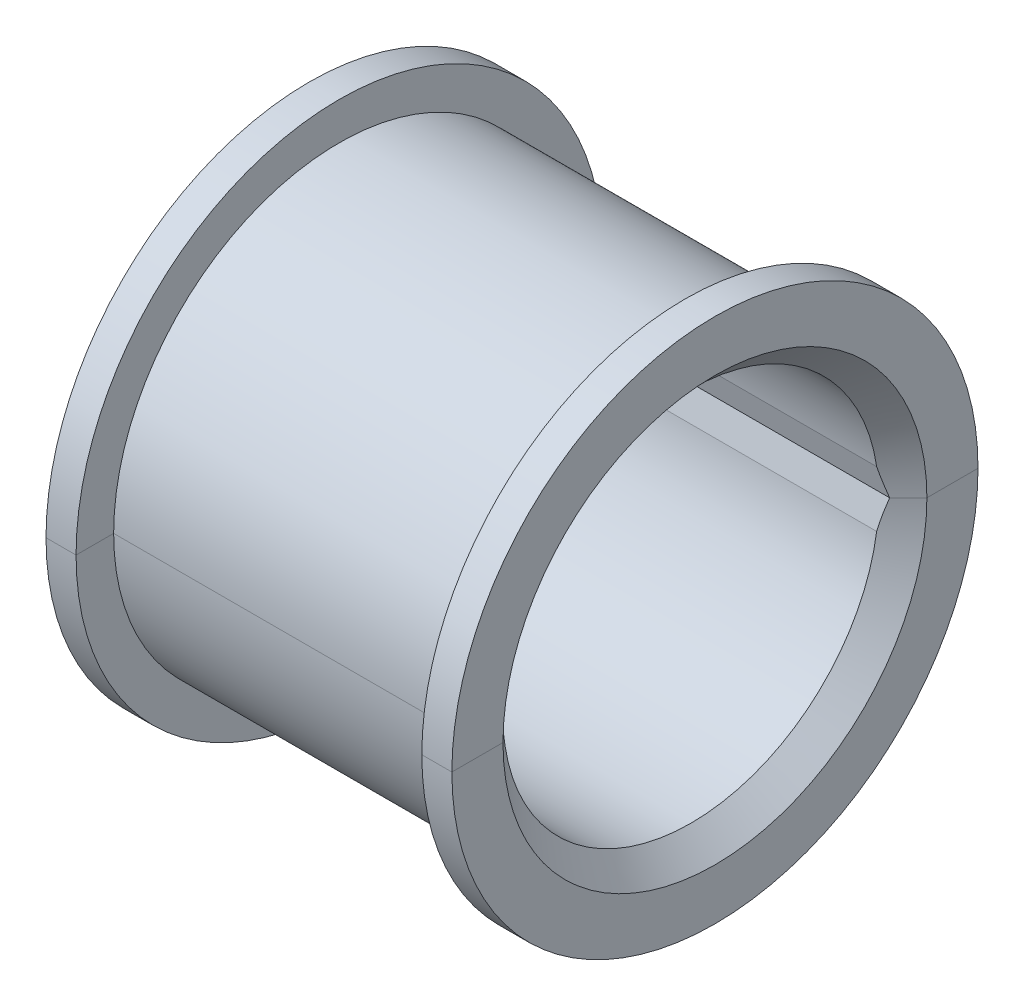
ISO-10303-21;
HEADER;
FILE_DESCRIPTION(('STEP AP214'),'2;1');
FILE_NAME('part.step','',(''),(''),'','','');
FILE_SCHEMA(('AUTOMOTIVE_DESIGN { 1 0 10303 214 1 1 1 1 }'));
ENDSEC;
DATA;
#1=APPLICATION_CONTEXT('core data for automotive mechanical design processes');
#2=APPLICATION_PROTOCOL_DEFINITION('international standard','automotive_design',2000,#1);
#3=PRODUCT_CONTEXT('',#1,'mechanical');
#4=PRODUCT('Part','Part','',(#3));
#5=PRODUCT_RELATED_PRODUCT_CATEGORY('part','',(#4));
#6=PRODUCT_DEFINITION_FORMATION('','',#4);
#7=PRODUCT_DEFINITION_CONTEXT('part definition',#1,'design');
#8=PRODUCT_DEFINITION('design','',#6,#7);
#9=PRODUCT_DEFINITION_SHAPE('','',#8);
#10=(LENGTH_UNIT() NAMED_UNIT(*) SI_UNIT(.MILLI.,.METRE.));
#11=(NAMED_UNIT(*) PLANE_ANGLE_UNIT() SI_UNIT($,.RADIAN.));
#12=(NAMED_UNIT(*) SI_UNIT($,.STERADIAN.) SOLID_ANGLE_UNIT());
#13=UNCERTAINTY_MEASURE_WITH_UNIT(LENGTH_MEASURE(1.E-05),#10,'distance_accuracy_value','');
#14=(GEOMETRIC_REPRESENTATION_CONTEXT(3) GLOBAL_UNCERTAINTY_ASSIGNED_CONTEXT((#13)) GLOBAL_UNIT_ASSIGNED_CONTEXT((#10,
#11,#12)) REPRESENTATION_CONTEXT('',''));
#15=CARTESIAN_POINT('',(0.,0.,0.));
#16=DIRECTION('',(0.,0.,1.));
#17=DIRECTION('',(1.,0.,0.));
#18=AXIS2_PLACEMENT_3D('',#15,#16,#17);
#19=CARTESIAN_POINT('',(-27.1959710235552,0.,0.));
#20=DIRECTION('',(1.,0.,0.));
#21=DIRECTION('',(0.,0.,-1.));
#22=AXIS2_PLACEMENT_3D('',#19,#20,#21);
#23=CYLINDRICAL_SURFACE('',#22,17.5);
#24=CARTESIAN_POINT('',(2.,0.,0.));
#25=DIRECTION('',(-1.,0.,0.));
#26=DIRECTION('',(0.,0.,-1.));
#27=AXIS2_PLACEMENT_3D('',#24,#25,#26);
#28=CIRCLE('',#27,17.5);
#29=CARTESIAN_POINT('',(2.,0.,-17.5));
#30=VERTEX_POINT('',#29);
#31=CARTESIAN_POINT('',(2.,0.,17.5));
#32=VERTEX_POINT('',#31);
#33=EDGE_CURVE('E243',#30,#32,#28,.T.);
#34=ORIENTED_EDGE('',*,*,#33,.T.);
#35=DIRECTION('',(-1.,0.,0.));
#36=VECTOR('',#35,1.);
#37=CARTESIAN_POINT('',(0.,0.,17.5));
#38=LINE('',#37,#36);
#39=CARTESIAN_POINT('',(0.,0.,17.5));
#40=VERTEX_POINT('',#39);
#41=EDGE_CURVE('E187',#32,#40,#38,.T.);
#42=ORIENTED_EDGE('',*,*,#41,.T.);
#43=CARTESIAN_POINT('',(0.,0.,0.));
#44=DIRECTION('',(-1.,0.,0.));
#45=DIRECTION('',(0.,0.,-1.));
#46=AXIS2_PLACEMENT_3D('',#43,#44,#45);
#47=CIRCLE('',#46,17.5);
#48=CARTESIAN_POINT('',(0.,0.,-17.5));
#49=VERTEX_POINT('',#48);
#50=EDGE_CURVE('E225',#49,#40,#47,.T.);
#51=ORIENTED_EDGE('',*,*,#50,.F.);
#52=DIRECTION('',(-1.,0.,0.));
#53=VECTOR('',#52,1.);
#54=CARTESIAN_POINT('',(0.,0.,-17.5));
#55=LINE('',#54,#53);
#56=EDGE_CURVE('E251',#30,#49,#55,.T.);
#57=ORIENTED_EDGE('',*,*,#56,.F.);
#58=EDGE_LOOP('',(#34,#42,#51,#57));
#59=FACE_BOUND('',#58,.T.);
#60=ADVANCED_FACE('F48',(#59),#23,.T.);
#61=CARTESIAN_POINT('',(2.,0.,-17.5));
#62=DIRECTION('',(1.,0.,0.));
#63=DIRECTION('',(0.,0.,-1.));
#64=AXIS2_PLACEMENT_3D('',#61,#62,#63);
#65=PLANE('',#64);
#66=CARTESIAN_POINT('',(2.,0.,0.));
#67=DIRECTION('',(-1.,0.,0.));
#68=DIRECTION('',(0.,0.,-1.));
#69=AXIS2_PLACEMENT_3D('',#66,#67,#68);
#70=CIRCLE('',#69,15.);
#71=CARTESIAN_POINT('',(2.,0.,-15.));
#72=VERTEX_POINT('',#71);
#73=CARTESIAN_POINT('',(2.,0.,15.));
#74=VERTEX_POINT('',#73);
#75=EDGE_CURVE('E240',#72,#74,#70,.T.);
#76=ORIENTED_EDGE('',*,*,#75,.T.);
#77=DIRECTION('',(0.,0.,1.));
#78=VECTOR('',#77,1.);
#79=CARTESIAN_POINT('',(2.,0.,17.5));
#80=LINE('',#79,#78);
#81=EDGE_CURVE('E257',#74,#32,#80,.T.);
#82=ORIENTED_EDGE('',*,*,#81,.T.);
#83=ORIENTED_EDGE('',*,*,#33,.F.);
#84=DIRECTION('',(0.,0.,-1.));
#85=VECTOR('',#84,1.);
#86=CARTESIAN_POINT('',(2.,0.,-17.5));
#87=LINE('',#86,#85);
#88=EDGE_CURVE('E254',#72,#30,#87,.T.);
#89=ORIENTED_EDGE('',*,*,#88,.F.);
#90=EDGE_LOOP('',(#76,#82,#83,#89));
#91=FACE_BOUND('',#90,.T.);
#92=ADVANCED_FACE('F50',(#91),#65,.T.);
#93=CARTESIAN_POINT('',(-27.1959710235552,0.,0.));
#94=DIRECTION('',(1.,0.,0.));
#95=DIRECTION('',(0.,0.,-1.));
#96=AXIS2_PLACEMENT_3D('',#93,#94,#95);
#97=CYLINDRICAL_SURFACE('',#96,15.);
#98=CARTESIAN_POINT('',(25.,0.,0.));
#99=DIRECTION('',(-1.,0.,0.));
#100=DIRECTION('',(0.,0.,-1.));
#101=AXIS2_PLACEMENT_3D('',#98,#99,#100);
#102=CIRCLE('',#101,15.);
#103=CARTESIAN_POINT('',(25.,0.,-15.));
#104=VERTEX_POINT('',#103);
#105=CARTESIAN_POINT('',(25.,0.,15.));
#106=VERTEX_POINT('',#105);
#107=EDGE_CURVE('E237',#104,#106,#102,.T.);
#108=ORIENTED_EDGE('',*,*,#107,.T.);
#109=DIRECTION('',(-1.,0.,0.));
#110=VECTOR('',#109,1.);
#111=CARTESIAN_POINT('',(2.,0.,15.));
#112=LINE('',#111,#110);
#113=EDGE_CURVE('E259',#106,#74,#112,.T.);
#114=ORIENTED_EDGE('',*,*,#113,.T.);
#115=ORIENTED_EDGE('',*,*,#75,.F.);
#116=DIRECTION('',(-1.,0.,0.));
#117=VECTOR('',#116,1.);
#118=CARTESIAN_POINT('',(2.,0.,-15.));
#119=LINE('',#118,#117);
#120=EDGE_CURVE('E288',#104,#72,#119,.T.);
#121=ORIENTED_EDGE('',*,*,#120,.F.);
#122=EDGE_LOOP('',(#108,#114,#115,#121));
#123=FACE_BOUND('',#122,.T.);
#124=ADVANCED_FACE('F294',(#123),#97,.T.);
#125=CARTESIAN_POINT('',(25.,0.,-15.));
#126=DIRECTION('',(-1.,0.,0.));
#127=DIRECTION('',(0.,0.,1.));
#128=AXIS2_PLACEMENT_3D('',#125,#126,#127);
#129=PLANE('',#128);
#130=CARTESIAN_POINT('',(25.,0.,0.));
#131=DIRECTION('',(-1.,0.,0.));
#132=DIRECTION('',(0.,0.,-1.));
#133=AXIS2_PLACEMENT_3D('',#130,#131,#132);
#134=CIRCLE('',#133,17.5);
#135=CARTESIAN_POINT('',(25.,0.,-17.5));
#136=VERTEX_POINT('',#135);
#137=CARTESIAN_POINT('',(25.,0.,17.5));
#138=VERTEX_POINT('',#137);
#139=EDGE_CURVE('E234',#136,#138,#134,.T.);
#140=ORIENTED_EDGE('',*,*,#139,.T.);
#141=DIRECTION('',(0.,0.,-1.));
#142=VECTOR('',#141,1.);
#143=CARTESIAN_POINT('',(25.,0.,15.));
#144=LINE('',#143,#142);
#145=EDGE_CURVE('E274',#138,#106,#144,.T.);
#146=ORIENTED_EDGE('',*,*,#145,.T.);
#147=ORIENTED_EDGE('',*,*,#107,.F.);
#148=DIRECTION('',(0.,0.,1.));
#149=VECTOR('',#148,1.);
#150=CARTESIAN_POINT('',(25.,0.,-15.));
#151=LINE('',#150,#149);
#152=EDGE_CURVE('E286',#136,#104,#151,.T.);
#153=ORIENTED_EDGE('',*,*,#152,.F.);
#154=EDGE_LOOP('',(#140,#146,#147,#153));
#155=FACE_BOUND('',#154,.T.);
#156=ADVANCED_FACE('F296',(#155),#129,.T.);
#157=CARTESIAN_POINT('',(-27.1959710235552,0.,0.));
#158=DIRECTION('',(1.,0.,0.));
#159=DIRECTION('',(0.,0.,-1.));
#160=AXIS2_PLACEMENT_3D('',#157,#158,#159);
#161=CYLINDRICAL_SURFACE('',#160,17.5);
#162=CARTESIAN_POINT('',(27.,0.,0.));
#163=DIRECTION('',(-1.,0.,0.));
#164=DIRECTION('',(0.,0.,-1.));
#165=AXIS2_PLACEMENT_3D('',#162,#163,#164);
#166=CIRCLE('',#165,17.5);
#167=CARTESIAN_POINT('',(27.,0.,-17.5));
#168=VERTEX_POINT('',#167);
#169=CARTESIAN_POINT('',(27.,0.,17.5));
#170=VERTEX_POINT('',#169);
#171=EDGE_CURVE('E231',#168,#170,#166,.T.);
#172=ORIENTED_EDGE('',*,*,#171,.T.);
#173=DIRECTION('',(-1.,0.,0.));
#174=VECTOR('',#173,1.);
#175=CARTESIAN_POINT('',(25.,0.,17.5));
#176=LINE('',#175,#174);
#177=EDGE_CURVE('E272',#170,#138,#176,.T.);
#178=ORIENTED_EDGE('',*,*,#177,.T.);
#179=ORIENTED_EDGE('',*,*,#139,.F.);
#180=DIRECTION('',(-1.,0.,0.));
#181=VECTOR('',#180,1.);
#182=CARTESIAN_POINT('',(25.,0.,-17.5));
#183=LINE('',#182,#181);
#184=EDGE_CURVE('E284',#168,#136,#183,.T.);
#185=ORIENTED_EDGE('',*,*,#184,.F.);
#186=EDGE_LOOP('',(#172,#178,#179,#185));
#187=FACE_BOUND('',#186,.T.);
#188=ADVANCED_FACE('F304',(#187),#161,.T.);
#189=CARTESIAN_POINT('',(27.,0.,-17.5));
#190=DIRECTION('',(1.,0.,0.));
#191=DIRECTION('',(0.,0.,-1.));
#192=AXIS2_PLACEMENT_3D('',#189,#190,#191);
#193=PLANE('',#192);
#194=CARTESIAN_POINT('',(27.,0.,0.));
#195=DIRECTION('',(-1.,0.,0.));
#196=DIRECTION('',(0.,0.,-1.));
#197=AXIS2_PLACEMENT_3D('',#194,#195,#196);
#198=CIRCLE('',#197,14.1);
#199=CARTESIAN_POINT('',(27.,0.,-14.1));
#200=VERTEX_POINT('',#199);
#201=CARTESIAN_POINT('',(27.,0.,14.1));
#202=VERTEX_POINT('',#201);
#203=EDGE_CURVE('E151',#200,#202,#198,.T.);
#204=ORIENTED_EDGE('',*,*,#203,.T.);
#205=DIRECTION('',(0.,0.,1.));
#206=VECTOR('',#205,1.);
#207=CARTESIAN_POINT('',(27.,0.,17.5));
#208=LINE('',#207,#206);
#209=EDGE_CURVE('E270',#202,#170,#208,.T.);
#210=ORIENTED_EDGE('',*,*,#209,.T.);
#211=ORIENTED_EDGE('',*,*,#171,.F.);
#212=DIRECTION('',(0.,0.,-1.));
#213=VECTOR('',#212,1.);
#214=CARTESIAN_POINT('',(27.,0.,-17.5));
#215=LINE('',#214,#213);
#216=EDGE_CURVE('E282',#200,#168,#215,.T.);
#217=ORIENTED_EDGE('',*,*,#216,.F.);
#218=EDGE_LOOP('',(#204,#210,#211,#217));
#219=FACE_BOUND('',#218,.T.);
#220=ADVANCED_FACE('F178',(#219),#193,.T.);
#221=CARTESIAN_POINT('',(25.4,0.,0.));
#222=DIRECTION('',(1.,0.,0.));
#223=DIRECTION('',(0.,0.,-1.));
#224=AXIS2_PLACEMENT_3D('',#221,#222,#223);
#225=CONICAL_SURFACE('',#224,12.5,0.785398163397448);
#226=CARTESIAN_POINT('',(26.2484013107677,1.50523763764391,-13.2632604290018));
#227=CARTESIAN_POINT('',(26.1742125034005,1.3094727485897,-13.2108053850733));
#228=CARTESIAN_POINT('',(26.1035443149631,1.11248075646836,-13.158021539869));
#229=CARTESIAN_POINT('',(25.9699618111538,0.715990498866815,-13.0517822955379));
#230=CARTESIAN_POINT('',(25.9070500982291,0.516491416814952,-12.9983266776113));
#231=CARTESIAN_POINT('',(25.7321191017047,-0.0821274818673336,-12.8379272271354));
#232=CARTESIAN_POINT('',(25.632578159723,-0.484803517368267,-12.7300305086115));
#233=CARTESIAN_POINT('',(25.5125692100453,-1.09432320495648,-12.5667102005514));
#234=CARTESIAN_POINT('',(25.4774360080468,-1.29855542495721,-12.5119863421338));
#235=CARTESIAN_POINT('',(25.4175143051028,-1.70845139513823,-12.402155047943));
#236=CARTESIAN_POINT('',(25.392725661705,-1.91411512556592,-12.3470476174625));
#237=CARTESIAN_POINT('',(25.3537853360265,-2.32813001355298,-12.2361126625719));
#238=CARTESIAN_POINT('',(25.3397250722862,-2.53648921154256,-12.180282983735));
#239=CARTESIAN_POINT('',(25.3228030378697,-2.95367350202841,-12.0684987900044));
#240=CARTESIAN_POINT('',(25.3199436107622,-3.16249868287876,-12.0125442514363));
#241=CARTESIAN_POINT('',(25.322795248114,-3.37126304142832,-11.9566060101545));
#242=B_SPLINE_CURVE_WITH_KNOTS('',3,(#226,#227,#228,#229,#230,#231,#232,#233,#234,#235,#236,
#237,#238,#239,#240,#241),.UNSPECIFIED.,.F.,.F.,(4,2,2,2,2,2,2,4),(0.,0.647386310265038,
1.29498924342088,2.57883998360912,3.22164408276933,3.86443932975761,4.5126526054734,
5.16100150063464),.UNSPECIFIED.);
#243=CARTESIAN_POINT('',(25.7599332195781,0.,-12.8599332195781));
#244=VERTEX_POINT('',#243);
#245=CARTESIAN_POINT('',(25.4,-1.86602540378441,-12.3599332195781));
#246=VERTEX_POINT('',#245);
#247=EDGE_CURVE('E137',#244,#246,#242,.T.);
#248=ORIENTED_EDGE('',*,*,#247,.T.);
#249=CARTESIAN_POINT('',(25.4,0.,0.));
#250=DIRECTION('',(-1.,0.,0.));
#251=DIRECTION('',(0.,0.,-1.));
#252=AXIS2_PLACEMENT_3D('',#249,#250,#251);
#253=CIRCLE('',#252,12.5);
#254=CARTESIAN_POINT('',(25.4,-1.86602540378441,12.3599332195781));
#255=VERTEX_POINT('',#254);
#256=EDGE_CURVE('E145',#246,#255,#253,.T.);
#257=ORIENTED_EDGE('',*,*,#256,.T.);
#258=CARTESIAN_POINT('',(25.322795248114,-3.37126304142832,11.9566060101545));
#259=CARTESIAN_POINT('',(25.3207751303388,-3.22191651610366,11.9966232910076));
#260=CARTESIAN_POINT('',(25.3216547122165,-3.07254784943274,12.0366465046166));
#261=CARTESIAN_POINT('',(25.3291708796214,-2.77395399400931,12.1166544870422));
#262=CARTESIAN_POINT('',(25.335807137728,-2.62472879757991,12.1566392579159));
#263=CARTESIAN_POINT('',(25.3642717238281,-2.17777214668943,12.2764009315737));
#264=CARTESIAN_POINT('',(25.3946526566406,-1.88051096406728,12.3560518253984));
#265=CARTESIAN_POINT('',(25.4766560164423,-1.29214121187084,12.5137050253504));
#266=CARTESIAN_POINT('',(25.5280404478011,-1.00100094414443,12.5917158249718));
#267=CARTESIAN_POINT('',(25.6503360314772,-0.42258663279072,12.7467014725897));
#268=CARTESIAN_POINT('',(25.7212465818298,-0.135312470262749,12.8236763524454));
#269=CARTESIAN_POINT('',(25.8328315457774,0.263886992744385,12.9306415261771));
#270=CARTESIAN_POINT('',(25.8661760137994,0.377776277403174,12.961158068028));
#271=CARTESIAN_POINT('',(25.9355356276717,0.604776477812425,13.0219825884093));
#272=CARTESIAN_POINT('',(25.97155031252,0.717887524254625,13.0522906019585));
#273=CARTESIAN_POINT('',(26.0462883240167,0.943837640993667,13.1128337532685));
#274=CARTESIAN_POINT('',(26.0850232530877,1.05667311915317,13.1430679285189));
#275=CARTESIAN_POINT('',(26.1649239330655,1.28155410283706,13.2033246064901));
#276=CARTESIAN_POINT('',(26.2060899813343,1.39359950983993,13.2333470828122));
#277=CARTESIAN_POINT('',(26.2484013107677,1.50523763764391,13.2632604290018));
#278=B_SPLINE_CURVE_WITH_KNOTS('',3,(#258,#259,#260,#261,#262,#263,#264,#265,#266,#267,#268,
#269,#270,#271,#272,#273,#274,#275,#276,#277),.UNSPECIFIED.,.F.,.F.,(4,2,2,2,2,2,2,2,2,4),(0.,
0.463828057975735,0.927629736690716,1.85446265420115,2.77107236023496,3.68765381155108,
4.0552261739228,4.42273522354899,4.79192009759984,5.16115022237338),.UNSPECIFIED.);
#279=CARTESIAN_POINT('',(25.7599332195781,0.,12.8599332195781));
#280=VERTEX_POINT('',#279);
#281=EDGE_CURVE('E182',#255,#280,#278,.T.);
#282=ORIENTED_EDGE('',*,*,#281,.T.);
#283=DIRECTION('',(0.707106781186549,0.,0.707106781186546));
#284=VECTOR('',#283,1.);
#285=CARTESIAN_POINT('',(27.,0.,14.1));
#286=LINE('',#285,#284);
#287=EDGE_CURVE('E266',#280,#202,#286,.T.);
#288=ORIENTED_EDGE('',*,*,#287,.T.);
#289=ORIENTED_EDGE('',*,*,#203,.F.);
#290=DIRECTION('',(0.707106781186549,0.,-0.707106781186546));
#291=VECTOR('',#290,1.);
#292=CARTESIAN_POINT('',(27.,0.,-14.1));
#293=LINE('',#292,#291);
#294=EDGE_CURVE('E157',#244,#200,#293,.T.);
#295=ORIENTED_EDGE('',*,*,#294,.F.);
#296=EDGE_LOOP('',(#248,#257,#282,#288,#289,#295));
#297=FACE_BOUND('',#296,.T.);
#298=ADVANCED_FACE('F155',(#297),#225,.F.);
#299=CARTESIAN_POINT('',(-27.1959710235552,0.,0.));
#300=DIRECTION('',(1.,0.,0.));
#301=DIRECTION('',(0.,0.,-1.));
#302=AXIS2_PLACEMENT_3D('',#299,#300,#301);
#303=CYLINDRICAL_SURFACE('',#302,12.5);
#304=DIRECTION('',(-1.,0.,0.));
#305=VECTOR('',#304,1.);
#306=CARTESIAN_POINT('',(27.,-1.86602540378441,-12.3599332195781));
#307=LINE('',#306,#305);
#308=CARTESIAN_POINT('',(1.6,-1.86602540378441,-12.3599332195781));
#309=VERTEX_POINT('',#308);
#310=EDGE_CURVE('E133',#246,#309,#307,.T.);
#311=ORIENTED_EDGE('',*,*,#310,.T.);
#312=CARTESIAN_POINT('',(1.6,0.,0.));
#313=DIRECTION('',(-1.,0.,0.));
#314=DIRECTION('',(0.,0.,-1.));
#315=AXIS2_PLACEMENT_3D('',#312,#313,#314);
#316=CIRCLE('',#315,12.5);
#317=CARTESIAN_POINT('',(1.6,-1.86602540378441,12.3599332195781));
#318=VERTEX_POINT('',#317);
#319=EDGE_CURVE('E152',#309,#318,#316,.T.);
#320=ORIENTED_EDGE('',*,*,#319,.T.);
#321=DIRECTION('',(-1.,0.,0.));
#322=VECTOR('',#321,1.);
#323=CARTESIAN_POINT('',(27.,-1.86602540378441,12.3599332195781));
#324=LINE('',#323,#322);
#325=EDGE_CURVE('E148',#255,#318,#324,.T.);
#326=ORIENTED_EDGE('',*,*,#325,.F.);
#327=ORIENTED_EDGE('',*,*,#256,.F.);
#328=EDGE_LOOP('',(#311,#320,#326,#327));
#329=FACE_BOUND('',#328,.T.);
#330=ADVANCED_FACE('F146',(#329),#303,.F.);
#331=CARTESIAN_POINT('',(0.,0.,0.));
#332=DIRECTION('',(-1.,0.,0.));
#333=DIRECTION('',(0.,0.,1.));
#334=AXIS2_PLACEMENT_3D('',#331,#332,#333);
#335=CONICAL_SURFACE('',#334,14.1,0.785398163397446);
#336=CARTESIAN_POINT('',(1.677204751886,-3.37126304142832,-11.9566060101545));
#337=CARTESIAN_POINT('',(1.67922486966115,-3.22191651610366,-11.9966232910076));
#338=CARTESIAN_POINT('',(1.67834528778346,-3.07254784943274,-12.0366465046166));
#339=CARTESIAN_POINT('',(1.67082912037863,-2.77395399400931,-12.1166544870422));
#340=CARTESIAN_POINT('',(1.66419286227199,-2.62472879757991,-12.1566392579159));
#341=CARTESIAN_POINT('',(1.63572827617191,-2.17777214668942,-12.2764009315737));
#342=CARTESIAN_POINT('',(1.60534734335937,-1.88051096406728,-12.3560518253984));
#343=CARTESIAN_POINT('',(1.52334398355772,-1.29214121187083,-12.5137050253504));
#344=CARTESIAN_POINT('',(1.47195955219889,-1.00100094414443,-12.5917158249718));
#345=CARTESIAN_POINT('',(1.34966396852275,-0.422586632790716,-12.7467014725897));
#346=CARTESIAN_POINT('',(1.27875341817019,-0.135312470262745,-12.8236763524454));
#347=CARTESIAN_POINT('',(1.16716845422256,0.263886992744388,-12.9306415261771));
#348=CARTESIAN_POINT('',(1.13382398620059,0.377776277403177,-12.961158068028));
#349=CARTESIAN_POINT('',(1.06446437232834,0.604776477812428,-13.0219825884093));
#350=CARTESIAN_POINT('',(1.02844968748001,0.717887524254628,-13.0522906019585));
#351=CARTESIAN_POINT('',(0.953711675983266,0.94383764099367,-13.1128337532685));
#352=CARTESIAN_POINT('',(0.914976746912264,1.05667311915317,-13.1430679285189));
#353=CARTESIAN_POINT('',(0.835076066934532,1.28155410283706,-13.2033246064901));
#354=CARTESIAN_POINT('',(0.793910018665653,1.39359950983993,-13.2333470828122));
#355=CARTESIAN_POINT('',(0.751598689232338,1.50523763764391,-13.2632604290018));
#356=B_SPLINE_CURVE_WITH_KNOTS('',3,(#336,#337,#338,#339,#340,#341,#342,#343,#344,#345,#346,
#347,#348,#349,#350,#351,#352,#353,#354,#355),.UNSPECIFIED.,.F.,.F.,(4,2,2,2,2,2,2,2,2,4),(0.,
0.463828057975735,0.927629736690717,1.85446265420115,2.77107236023496,3.68765381155109,
4.0552261739228,4.42273522354899,4.79192009759984,5.16115022237337),.UNSPECIFIED.);
#357=CARTESIAN_POINT('',(1.24006678042185,0.,-12.8599332195781));
#358=VERTEX_POINT('',#357);
#359=EDGE_CURVE('E139',#309,#358,#356,.T.);
#360=ORIENTED_EDGE('',*,*,#359,.T.);
#361=DIRECTION('',(0.707106781186549,0.,0.707106781186546));
#362=VECTOR('',#361,1.);
#363=CARTESIAN_POINT('',(1.6,0.,-12.5));
#364=LINE('',#363,#362);
#365=CARTESIAN_POINT('',(0.,0.,-14.1));
#366=VERTEX_POINT('',#365);
#367=EDGE_CURVE('E221',#366,#358,#364,.T.);
#368=ORIENTED_EDGE('',*,*,#367,.F.);
#369=CARTESIAN_POINT('',(0.,0.,0.));
#370=DIRECTION('',(-1.,0.,0.));
#371=DIRECTION('',(0.,0.,-1.));
#372=AXIS2_PLACEMENT_3D('',#369,#370,#371);
#373=CIRCLE('',#372,14.1);
#374=CARTESIAN_POINT('',(0.,0.,14.1));
#375=VERTEX_POINT('',#374);
#376=EDGE_CURVE('E223',#366,#375,#373,.T.);
#377=ORIENTED_EDGE('',*,*,#376,.T.);
#378=DIRECTION('',(0.707106781186549,0.,-0.707106781186546));
#379=VECTOR('',#378,1.);
#380=CARTESIAN_POINT('',(1.6,0.,12.5));
#381=LINE('',#380,#379);
#382=CARTESIAN_POINT('',(1.24006678042185,0.,12.8599332195781));
#383=VERTEX_POINT('',#382);
#384=EDGE_CURVE('E264',#375,#383,#381,.T.);
#385=ORIENTED_EDGE('',*,*,#384,.T.);
#386=CARTESIAN_POINT('',(0.751598689232339,1.50523763764391,13.2632604290018));
#387=CARTESIAN_POINT('',(0.825787496599475,1.3094727485897,13.2108053850733));
#388=CARTESIAN_POINT('',(0.896455685036848,1.11248075646836,13.158021539869));
#389=CARTESIAN_POINT('',(1.03003818884622,0.715990498866817,13.0517822955379));
#390=CARTESIAN_POINT('',(1.09294990177093,0.516491416814954,12.9983266776113));
#391=CARTESIAN_POINT('',(1.26788089829532,-0.0821274818673323,12.8379272271354));
#392=CARTESIAN_POINT('',(1.36742184027695,-0.484803517368266,12.7300305086115));
#393=CARTESIAN_POINT('',(1.4874307899547,-1.09432320495648,12.5667102005514));
#394=CARTESIAN_POINT('',(1.52256399195316,-1.29855542495721,12.5119863421338));
#395=CARTESIAN_POINT('',(1.58248569489724,-1.70845139513823,12.402155047943));
#396=CARTESIAN_POINT('',(1.60727433829495,-1.91411512556592,12.3470476174625));
#397=CARTESIAN_POINT('',(1.64621466397349,-2.32813001355298,12.2361126625719));
#398=CARTESIAN_POINT('',(1.66027492771378,-2.53648921154256,12.180282983735));
#399=CARTESIAN_POINT('',(1.67719696213031,-2.95367350202841,12.0684987900044));
#400=CARTESIAN_POINT('',(1.68005638923781,-3.16249868287876,12.0125442514363));
#401=CARTESIAN_POINT('',(1.677204751886,-3.37126304142832,11.9566060101545));
#402=B_SPLINE_CURVE_WITH_KNOTS('',3,(#386,#387,#388,#389,#390,#391,#392,#393,#394,#395,#396,
#397,#398,#399,#400,#401),.UNSPECIFIED.,.F.,.F.,(4,2,2,2,2,2,2,4),(0.,0.647386310265037,
1.29498924342088,2.57883998360912,3.22164408276933,3.86443932975761,4.5126526054734,
5.16100150063464),.UNSPECIFIED.);
#403=EDGE_CURVE('E159',#383,#318,#402,.T.);
#404=ORIENTED_EDGE('',*,*,#403,.T.);
#405=ORIENTED_EDGE('',*,*,#319,.F.);
#406=EDGE_LOOP('',(#360,#368,#377,#385,#404,#405));
#407=FACE_BOUND('',#406,.T.);
#408=ADVANCED_FACE('F210',(#407),#335,.F.);
#409=CARTESIAN_POINT('',(0.,0.,-14.1));
#410=DIRECTION('',(-1.,0.,0.));
#411=DIRECTION('',(0.,0.,1.));
#412=AXIS2_PLACEMENT_3D('',#409,#410,#411);
#413=PLANE('',#412);
#414=DIRECTION('',(0.,0.,1.));
#415=VECTOR('',#414,1.);
#416=CARTESIAN_POINT('',(0.,0.,-14.1));
#417=LINE('',#416,#415);
#418=EDGE_CURVE('E278',#49,#366,#417,.T.);
#419=ORIENTED_EDGE('',*,*,#418,.F.);
#420=ORIENTED_EDGE('',*,*,#50,.T.);
#421=DIRECTION('',(0.,0.,-1.));
#422=VECTOR('',#421,1.);
#423=CARTESIAN_POINT('',(0.,0.,14.1));
#424=LINE('',#423,#422);
#425=EDGE_CURVE('E262',#40,#375,#424,.T.);
#426=ORIENTED_EDGE('',*,*,#425,.T.);
#427=ORIENTED_EDGE('',*,*,#376,.F.);
#428=EDGE_LOOP('',(#419,#420,#426,#427));
#429=FACE_BOUND('',#428,.T.);
#430=ADVANCED_FACE('F204',(#429),#413,.T.);
#431=CARTESIAN_POINT('',(0.,0.,0.));
#432=DIRECTION('',(0.,1.,0.));
#433=DIRECTION('',(-1.,0.,0.));
#434=AXIS2_PLACEMENT_3D('',#431,#432,#433);
#435=PLANE('',#434);
#436=DIRECTION('',(1.,0.,0.));
#437=VECTOR('',#436,1.);
#438=CARTESIAN_POINT('',(0.,0.,-12.8599332195781));
#439=LINE('',#438,#437);
#440=EDGE_CURVE('E12',#358,#244,#439,.T.);
#441=ORIENTED_EDGE('',*,*,#440,.T.);
#442=ORIENTED_EDGE('',*,*,#294,.T.);
#443=ORIENTED_EDGE('',*,*,#216,.T.);
#444=ORIENTED_EDGE('',*,*,#184,.T.);
#445=ORIENTED_EDGE('',*,*,#152,.T.);
#446=ORIENTED_EDGE('',*,*,#120,.T.);
#447=ORIENTED_EDGE('',*,*,#88,.T.);
#448=ORIENTED_EDGE('',*,*,#56,.T.);
#449=ORIENTED_EDGE('',*,*,#418,.T.);
#450=ORIENTED_EDGE('',*,*,#367,.T.);
#451=EDGE_LOOP('',(#441,#442,#443,#444,#445,#446,#447,#448,#449,#450));
#452=FACE_BOUND('',#451,.T.);
#453=ADVANCED_FACE('F200',(#452),#435,.T.);
#454=CARTESIAN_POINT('',(0.,0.,0.));
#455=DIRECTION('',(0.,-1.,0.));
#456=DIRECTION('',(-1.,0.,0.));
#457=AXIS2_PLACEMENT_3D('',#454,#455,#456);
#458=PLANE('',#457);
#459=ORIENTED_EDGE('',*,*,#384,.F.);
#460=ORIENTED_EDGE('',*,*,#425,.F.);
#461=ORIENTED_EDGE('',*,*,#41,.F.);
#462=ORIENTED_EDGE('',*,*,#81,.F.);
#463=ORIENTED_EDGE('',*,*,#113,.F.);
#464=ORIENTED_EDGE('',*,*,#145,.F.);
#465=ORIENTED_EDGE('',*,*,#177,.F.);
#466=ORIENTED_EDGE('',*,*,#209,.F.);
#467=ORIENTED_EDGE('',*,*,#287,.F.);
#468=DIRECTION('',(1.,0.,0.));
#469=VECTOR('',#468,1.);
#470=CARTESIAN_POINT('',(0.,0.,12.8599332195781));
#471=LINE('',#470,#469);
#472=EDGE_CURVE('E56',#383,#280,#471,.T.);
#473=ORIENTED_EDGE('',*,*,#472,.F.);
#474=EDGE_LOOP('',(#459,#460,#461,#462,#463,#464,#465,#466,#467,#473));
#475=FACE_BOUND('',#474,.T.);
#476=ADVANCED_FACE('F196',(#475),#458,.F.);
#477=CARTESIAN_POINT('',(27.,0.,12.8599332195781));
#478=DIRECTION('',(0.,-0.258819045102524,0.965925826289068));
#479=DIRECTION('',(0.,0.965925826289068,0.258819045102524));
#480=AXIS2_PLACEMENT_3D('',#477,#478,#479);
#481=PLANE('',#480);
#482=ORIENTED_EDGE('',*,*,#281,.F.);
#483=ORIENTED_EDGE('',*,*,#325,.T.);
#484=ORIENTED_EDGE('',*,*,#403,.F.);
#485=ORIENTED_EDGE('',*,*,#472,.T.);
#486=EDGE_LOOP('',(#482,#483,#484,#485));
#487=FACE_BOUND('',#486,.T.);
#488=ADVANCED_FACE('F192',(#487),#481,.F.);
#489=CARTESIAN_POINT('',(27.,0.,-12.8599332195781));
#490=DIRECTION('',(0.,-0.258819045102524,-0.965925826289068));
#491=DIRECTION('',(0.,-0.965925826289068,0.258819045102524));
#492=AXIS2_PLACEMENT_3D('',#489,#490,#491);
#493=PLANE('',#492);
#494=ORIENTED_EDGE('',*,*,#247,.F.);
#495=ORIENTED_EDGE('',*,*,#440,.F.);
#496=ORIENTED_EDGE('',*,*,#359,.F.);
#497=ORIENTED_EDGE('',*,*,#310,.F.);
#498=EDGE_LOOP('',(#494,#495,#496,#497));
#499=FACE_BOUND('',#498,.T.);
#500=ADVANCED_FACE('F135',(#499),#493,.F.);
#501=CLOSED_SHELL('',(#60,#92,#124,#156,#188,#220,#298,#330,#408,#430,#453,#476,#488,#500));
#502=MANIFOLD_SOLID_BREP('B2',#501);
#503=CARTESIAN_POINT('',(-27.1959710235552,0.,0.));
#504=DIRECTION('',(1.,0.,0.));
#505=DIRECTION('',(0.,0.,-1.));
#506=AXIS2_PLACEMENT_3D('',#503,#504,#505);
#507=CYLINDRICAL_SURFACE('',#506,17.5);
#508=CARTESIAN_POINT('',(2.,0.,0.));
#509=DIRECTION('',(1.,0.,0.));
#510=DIRECTION('',(0.,0.,-1.));
#511=AXIS2_PLACEMENT_3D('',#508,#509,#510);
#512=CIRCLE('',#511,17.5);
#513=CARTESIAN_POINT('',(2.,0.,-17.5));
#514=VERTEX_POINT('',#513);
#515=CARTESIAN_POINT('',(2.,0.,17.5));
#516=VERTEX_POINT('',#515);
#517=EDGE_CURVE('E520',#514,#516,#512,.T.);
#518=ORIENTED_EDGE('',*,*,#517,.F.);
#519=DIRECTION('',(-1.,0.,0.));
#520=VECTOR('',#519,1.);
#521=CARTESIAN_POINT('',(0.,0.,-17.5));
#522=LINE('',#521,#520);
#523=CARTESIAN_POINT('',(0.,0.,-17.5));
#524=VERTEX_POINT('',#523);
#525=EDGE_CURVE('E552',#514,#524,#522,.T.);
#526=ORIENTED_EDGE('',*,*,#525,.T.);
#527=CARTESIAN_POINT('',(0.,0.,0.));
#528=DIRECTION('',(1.,0.,0.));
#529=DIRECTION('',(0.,0.,-1.));
#530=AXIS2_PLACEMENT_3D('',#527,#528,#529);
#531=CIRCLE('',#530,17.5);
#532=CARTESIAN_POINT('',(0.,0.,17.5));
#533=VERTEX_POINT('',#532);
#534=EDGE_CURVE('E578',#524,#533,#531,.T.);
#535=ORIENTED_EDGE('',*,*,#534,.T.);
#536=DIRECTION('',(-1.,0.,0.));
#537=VECTOR('',#536,1.);
#538=CARTESIAN_POINT('',(0.,0.,17.5));
#539=LINE('',#538,#537);
#540=EDGE_CURVE('E587',#516,#533,#539,.T.);
#541=ORIENTED_EDGE('',*,*,#540,.F.);
#542=EDGE_LOOP('',(#518,#526,#535,#541));
#543=FACE_BOUND('',#542,.T.);
#544=ADVANCED_FACE('F399',(#543),#507,.T.);
#545=CARTESIAN_POINT('',(2.,0.,-17.5));
#546=DIRECTION('',(1.,0.,0.));
#547=DIRECTION('',(0.,0.,-1.));
#548=AXIS2_PLACEMENT_3D('',#545,#546,#547);
#549=PLANE('',#548);
#550=CARTESIAN_POINT('',(2.,0.,0.));
#551=DIRECTION('',(1.,0.,0.));
#552=DIRECTION('',(0.,0.,-1.));
#553=AXIS2_PLACEMENT_3D('',#550,#551,#552);
#554=CIRCLE('',#553,15.);
#555=CARTESIAN_POINT('',(2.,0.,-15.));
#556=VERTEX_POINT('',#555);
#557=CARTESIAN_POINT('',(2.,0.,15.));
#558=VERTEX_POINT('',#557);
#559=EDGE_CURVE('E518',#556,#558,#554,.T.);
#560=ORIENTED_EDGE('',*,*,#559,.F.);
#561=DIRECTION('',(0.,0.,-1.));
#562=VECTOR('',#561,1.);
#563=CARTESIAN_POINT('',(2.,0.,-17.5));
#564=LINE('',#563,#562);
#565=EDGE_CURVE('E575',#556,#514,#564,.T.);
#566=ORIENTED_EDGE('',*,*,#565,.T.);
#567=ORIENTED_EDGE('',*,*,#517,.T.);
#568=DIRECTION('',(0.,0.,1.));
#569=VECTOR('',#568,1.);
#570=CARTESIAN_POINT('',(2.,0.,17.5));
#571=LINE('',#570,#569);
#572=EDGE_CURVE('E549',#558,#516,#571,.T.);
#573=ORIENTED_EDGE('',*,*,#572,.F.);
#574=EDGE_LOOP('',(#560,#566,#567,#573));
#575=FACE_BOUND('',#574,.T.);
#576=ADVANCED_FACE('F401',(#575),#549,.T.);
#577=CARTESIAN_POINT('',(-27.1959710235552,0.,0.));
#578=DIRECTION('',(1.,0.,0.));
#579=DIRECTION('',(0.,0.,-1.));
#580=AXIS2_PLACEMENT_3D('',#577,#578,#579);
#581=CYLINDRICAL_SURFACE('',#580,15.);
#582=CARTESIAN_POINT('',(25.,0.,0.));
#583=DIRECTION('',(1.,0.,0.));
#584=DIRECTION('',(0.,0.,-1.));
#585=AXIS2_PLACEMENT_3D('',#582,#583,#584);
#586=CIRCLE('',#585,15.);
#587=CARTESIAN_POINT('',(25.,0.,-15.));
#588=VERTEX_POINT('',#587);
#589=CARTESIAN_POINT('',(25.,0.,15.));
#590=VERTEX_POINT('',#589);
#591=EDGE_CURVE('E516',#588,#590,#586,.T.);
#592=ORIENTED_EDGE('',*,*,#591,.F.);
#593=DIRECTION('',(-1.,0.,0.));
#594=VECTOR('',#593,1.);
#595=CARTESIAN_POINT('',(2.,0.,-15.));
#596=LINE('',#595,#594);
#597=EDGE_CURVE('E572',#588,#556,#596,.T.);
#598=ORIENTED_EDGE('',*,*,#597,.T.);
#599=ORIENTED_EDGE('',*,*,#559,.T.);
#600=DIRECTION('',(-1.,0.,0.));
#601=VECTOR('',#600,1.);
#602=CARTESIAN_POINT('',(2.,0.,15.));
#603=LINE('',#602,#601);
#604=EDGE_CURVE('E546',#590,#558,#603,.T.);
#605=ORIENTED_EDGE('',*,*,#604,.F.);
#606=EDGE_LOOP('',(#592,#598,#599,#605));
#607=FACE_BOUND('',#606,.T.);
#608=ADVANCED_FACE('F651',(#607),#581,.T.);
#609=CARTESIAN_POINT('',(25.,0.,-15.));
#610=DIRECTION('',(-1.,0.,0.));
#611=DIRECTION('',(0.,0.,1.));
#612=AXIS2_PLACEMENT_3D('',#609,#610,#611);
#613=PLANE('',#612);
#614=CARTESIAN_POINT('',(25.,0.,0.));
#615=DIRECTION('',(1.,0.,0.));
#616=DIRECTION('',(0.,0.,-1.));
#617=AXIS2_PLACEMENT_3D('',#614,#615,#616);
#618=CIRCLE('',#617,17.5);
#619=CARTESIAN_POINT('',(25.,0.,-17.5));
#620=VERTEX_POINT('',#619);
#621=CARTESIAN_POINT('',(25.,0.,17.5));
#622=VERTEX_POINT('',#621);
#623=EDGE_CURVE('E514',#620,#622,#618,.T.);
#624=ORIENTED_EDGE('',*,*,#623,.F.);
#625=DIRECTION('',(0.,0.,1.));
#626=VECTOR('',#625,1.);
#627=CARTESIAN_POINT('',(25.,0.,-15.));
#628=LINE('',#627,#626);
#629=EDGE_CURVE('E569',#620,#588,#628,.T.);
#630=ORIENTED_EDGE('',*,*,#629,.T.);
#631=ORIENTED_EDGE('',*,*,#591,.T.);
#632=DIRECTION('',(0.,0.,-1.));
#633=VECTOR('',#632,1.);
#634=CARTESIAN_POINT('',(25.,0.,15.));
#635=LINE('',#634,#633);
#636=EDGE_CURVE('E543',#622,#590,#635,.T.);
#637=ORIENTED_EDGE('',*,*,#636,.F.);
#638=EDGE_LOOP('',(#624,#630,#631,#637));
#639=FACE_BOUND('',#638,.T.);
#640=ADVANCED_FACE('F648',(#639),#613,.T.);
#641=CARTESIAN_POINT('',(-27.1959710235552,0.,0.));
#642=DIRECTION('',(1.,0.,0.));
#643=DIRECTION('',(0.,0.,-1.));
#644=AXIS2_PLACEMENT_3D('',#641,#642,#643);
#645=CYLINDRICAL_SURFACE('',#644,17.5);
#646=CARTESIAN_POINT('',(27.,0.,0.));
#647=DIRECTION('',(1.,0.,0.));
#648=DIRECTION('',(0.,0.,-1.));
#649=AXIS2_PLACEMENT_3D('',#646,#647,#648);
#650=CIRCLE('',#649,17.5);
#651=CARTESIAN_POINT('',(27.,0.,-17.5));
#652=VERTEX_POINT('',#651);
#653=CARTESIAN_POINT('',(27.,0.,17.5));
#654=VERTEX_POINT('',#653);
#655=EDGE_CURVE('E507',#652,#654,#650,.T.);
#656=ORIENTED_EDGE('',*,*,#655,.F.);
#657=DIRECTION('',(-1.,0.,0.));
#658=VECTOR('',#657,1.);
#659=CARTESIAN_POINT('',(25.,0.,-17.5));
#660=LINE('',#659,#658);
#661=EDGE_CURVE('E566',#652,#620,#660,.T.);
#662=ORIENTED_EDGE('',*,*,#661,.T.);
#663=ORIENTED_EDGE('',*,*,#623,.T.);
#664=DIRECTION('',(-1.,0.,0.));
#665=VECTOR('',#664,1.);
#666=CARTESIAN_POINT('',(25.,0.,17.5));
#667=LINE('',#666,#665);
#668=EDGE_CURVE('E535',#654,#622,#667,.T.);
#669=ORIENTED_EDGE('',*,*,#668,.F.);
#670=EDGE_LOOP('',(#656,#662,#663,#669));
#671=FACE_BOUND('',#670,.T.);
#672=ADVANCED_FACE('F644',(#671),#645,.T.);
#673=CARTESIAN_POINT('',(27.,0.,-17.5));
#674=DIRECTION('',(1.,0.,0.));
#675=DIRECTION('',(0.,0.,-1.));
#676=AXIS2_PLACEMENT_3D('',#673,#674,#675);
#677=PLANE('',#676);
#678=CARTESIAN_POINT('',(27.,0.,0.));
#679=DIRECTION('',(1.,0.,0.));
#680=DIRECTION('',(0.,0.,-1.));
#681=AXIS2_PLACEMENT_3D('',#678,#679,#680);
#682=CIRCLE('',#681,14.1);
#683=CARTESIAN_POINT('',(27.,0.,-14.1));
#684=VERTEX_POINT('',#683);
#685=CARTESIAN_POINT('',(27.,0.,14.1));
#686=VERTEX_POINT('',#685);
#687=EDGE_CURVE('E504',#684,#686,#682,.T.);
#688=ORIENTED_EDGE('',*,*,#687,.F.);
#689=DIRECTION('',(0.,0.,-1.));
#690=VECTOR('',#689,1.);
#691=CARTESIAN_POINT('',(27.,0.,-17.5));
#692=LINE('',#691,#690);
#693=EDGE_CURVE('E563',#684,#652,#692,.T.);
#694=ORIENTED_EDGE('',*,*,#693,.T.);
#695=ORIENTED_EDGE('',*,*,#655,.T.);
#696=DIRECTION('',(0.,0.,1.));
#697=VECTOR('',#696,1.);
#698=CARTESIAN_POINT('',(27.,0.,17.5));
#699=LINE('',#698,#697);
#700=EDGE_CURVE('E533',#686,#654,#699,.T.);
#701=ORIENTED_EDGE('',*,*,#700,.F.);
#702=EDGE_LOOP('',(#688,#694,#695,#701));
#703=FACE_BOUND('',#702,.T.);
#704=ADVANCED_FACE('F631',(#703),#677,.T.);
#705=CARTESIAN_POINT('',(25.4,0.,0.));
#706=DIRECTION('',(1.,0.,0.));
#707=DIRECTION('',(0.,0.,-1.));
#708=AXIS2_PLACEMENT_3D('',#705,#706,#707);
#709=CONICAL_SURFACE('',#708,12.5,0.785398163397448);
#710=CARTESIAN_POINT('',(26.2484013107677,-1.50523763764391,-13.2632604290018));
#711=CARTESIAN_POINT('',(26.1742125034005,-1.3094727485897,-13.2108053850733));
#712=CARTESIAN_POINT('',(26.1035443149631,-1.11248075646836,-13.158021539869));
#713=CARTESIAN_POINT('',(25.9699618111538,-0.715990498866815,-13.0517822955379));
#714=CARTESIAN_POINT('',(25.9070500982291,-0.516491416814952,-12.9983266776113));
#715=CARTESIAN_POINT('',(25.7321191017047,0.0821274818673336,-12.8379272271354));
#716=CARTESIAN_POINT('',(25.632578159723,0.484803517368267,-12.7300305086115));
#717=CARTESIAN_POINT('',(25.5125692100453,1.09432320495648,-12.5667102005514));
#718=CARTESIAN_POINT('',(25.4774360080468,1.29855542495721,-12.5119863421338));
#719=CARTESIAN_POINT('',(25.4175143051028,1.70845139513823,-12.402155047943));
#720=CARTESIAN_POINT('',(25.392725661705,1.91411512556592,-12.3470476174625));
#721=CARTESIAN_POINT('',(25.3537853360265,2.32813001355298,-12.2361126625719));
#722=CARTESIAN_POINT('',(25.3397250722862,2.53648921154256,-12.180282983735));
#723=CARTESIAN_POINT('',(25.3228030378697,2.95367350202841,-12.0684987900044));
#724=CARTESIAN_POINT('',(25.3199436107622,3.16249868287876,-12.0125442514363));
#725=CARTESIAN_POINT('',(25.322795248114,3.37126304142832,-11.9566060101545));
#726=B_SPLINE_CURVE_WITH_KNOTS('',3,(#710,#711,#712,#713,#714,#715,#716,#717,#718,#719,#720,
#721,#722,#723,#724,#725),.UNSPECIFIED.,.F.,.F.,(4,2,2,2,2,2,2,4),(0.,0.647386310265038,
1.29498924342088,2.57883998360912,3.22164408276933,3.86443932975761,4.5126526054734,
5.16100150063464),.UNSPECIFIED.);
#727=CARTESIAN_POINT('',(25.7599332195781,0.,-12.8599332195781));
#728=VERTEX_POINT('',#727);
#729=CARTESIAN_POINT('',(25.4,1.86602540378441,-12.3599332195781));
#730=VERTEX_POINT('',#729);
#731=EDGE_CURVE('E486',#728,#730,#726,.T.);
#732=ORIENTED_EDGE('',*,*,#731,.F.);
#733=DIRECTION('',(0.707106781186549,0.,-0.707106781186546));
#734=VECTOR('',#733,1.);
#735=CARTESIAN_POINT('',(27.,0.,-14.1));
#736=LINE('',#735,#734);
#737=EDGE_CURVE('E561',#728,#684,#736,.T.);
#738=ORIENTED_EDGE('',*,*,#737,.T.);
#739=ORIENTED_EDGE('',*,*,#687,.T.);
#740=DIRECTION('',(0.707106781186549,0.,0.707106781186546));
#741=VECTOR('',#740,1.);
#742=CARTESIAN_POINT('',(27.,0.,14.1));
#743=LINE('',#742,#741);
#744=CARTESIAN_POINT('',(25.7599332195781,0.,12.8599332195781));
#745=VERTEX_POINT('',#744);
#746=EDGE_CURVE('E525',#745,#686,#743,.T.);
#747=ORIENTED_EDGE('',*,*,#746,.F.);
#748=CARTESIAN_POINT('',(25.322795248114,3.37126304142832,11.9566060101545));
#749=CARTESIAN_POINT('',(25.3207751303388,3.22191651610366,11.9966232910076));
#750=CARTESIAN_POINT('',(25.3216547122165,3.07254784943274,12.0366465046166));
#751=CARTESIAN_POINT('',(25.3291708796214,2.77395399400931,12.1166544870422));
#752=CARTESIAN_POINT('',(25.335807137728,2.62472879757991,12.1566392579159));
#753=CARTESIAN_POINT('',(25.3642717238281,2.17777214668943,12.2764009315737));
#754=CARTESIAN_POINT('',(25.3946526566406,1.88051096406728,12.3560518253984));
#755=CARTESIAN_POINT('',(25.4766560164423,1.29214121187084,12.5137050253504));
#756=CARTESIAN_POINT('',(25.5280404478011,1.00100094414443,12.5917158249718));
#757=CARTESIAN_POINT('',(25.6503360314772,0.42258663279072,12.7467014725897));
#758=CARTESIAN_POINT('',(25.7212465818298,0.135312470262749,12.8236763524454));
#759=CARTESIAN_POINT('',(25.8328315457774,-0.263886992744385,12.9306415261771));
#760=CARTESIAN_POINT('',(25.8661760137994,-0.377776277403174,12.961158068028));
#761=CARTESIAN_POINT('',(25.9355356276717,-0.604776477812425,13.0219825884093));
#762=CARTESIAN_POINT('',(25.97155031252,-0.717887524254625,13.0522906019585));
#763=CARTESIAN_POINT('',(26.0462883240167,-0.943837640993667,13.1128337532685));
#764=CARTESIAN_POINT('',(26.0850232530877,-1.05667311915317,13.1430679285189));
#765=CARTESIAN_POINT('',(26.1649239330655,-1.28155410283706,13.2033246064901));
#766=CARTESIAN_POINT('',(26.2060899813343,-1.39359950983993,13.2333470828122));
#767=CARTESIAN_POINT('',(26.2484013107677,-1.50523763764391,13.2632604290018));
#768=B_SPLINE_CURVE_WITH_KNOTS('',3,(#748,#749,#750,#751,#752,#753,#754,#755,#756,#757,#758,
#759,#760,#761,#762,#763,#764,#765,#766,#767),.UNSPECIFIED.,.F.,.F.,(4,2,2,2,2,2,2,2,2,4),(0.,
0.463828057975735,0.927629736690716,1.85446265420115,2.77107236023496,3.68765381155108,
4.0552261739228,4.42273522354899,4.79192009759984,5.16115022237338),.UNSPECIFIED.);
#769=CARTESIAN_POINT('',(25.4,1.86602540378441,12.3599332195781));
#770=VERTEX_POINT('',#769);
#771=EDGE_CURVE('E421',#770,#745,#768,.T.);
#772=ORIENTED_EDGE('',*,*,#771,.F.);
#773=CARTESIAN_POINT('',(25.4,0.,0.));
#774=DIRECTION('',(1.,0.,0.));
#775=DIRECTION('',(0.,0.,-1.));
#776=AXIS2_PLACEMENT_3D('',#773,#774,#775);
#777=CIRCLE('',#776,12.5);
#778=EDGE_CURVE('E499',#730,#770,#777,.T.);
#779=ORIENTED_EDGE('',*,*,#778,.F.);
#780=EDGE_LOOP('',(#732,#738,#739,#747,#772,#779));
#781=FACE_BOUND('',#780,.T.);
#782=ADVANCED_FACE('F502',(#781),#709,.F.);
#783=CARTESIAN_POINT('',(-27.1959710235552,0.,0.));
#784=DIRECTION('',(1.,0.,0.));
#785=DIRECTION('',(0.,0.,-1.));
#786=AXIS2_PLACEMENT_3D('',#783,#784,#785);
#787=CYLINDRICAL_SURFACE('',#786,12.5);
#788=DIRECTION('',(-1.,0.,0.));
#789=VECTOR('',#788,1.);
#790=CARTESIAN_POINT('',(27.,1.86602540378441,-12.3599332195781));
#791=LINE('',#790,#789);
#792=CARTESIAN_POINT('',(1.6,1.86602540378441,-12.3599332195781));
#793=VERTEX_POINT('',#792);
#794=EDGE_CURVE('E489',#730,#793,#791,.T.);
#795=ORIENTED_EDGE('',*,*,#794,.F.);
#796=ORIENTED_EDGE('',*,*,#778,.T.);
#797=DIRECTION('',(-1.,0.,0.));
#798=VECTOR('',#797,1.);
#799=CARTESIAN_POINT('',(27.,1.86602540378441,12.3599332195781));
#800=LINE('',#799,#798);
#801=CARTESIAN_POINT('',(1.6,1.86602540378441,12.3599332195781));
#802=VERTEX_POINT('',#801);
#803=EDGE_CURVE('E493',#770,#802,#800,.T.);
#804=ORIENTED_EDGE('',*,*,#803,.T.);
#805=CARTESIAN_POINT('',(1.6,0.,0.));
#806=DIRECTION('',(1.,0.,0.));
#807=DIRECTION('',(0.,0.,-1.));
#808=AXIS2_PLACEMENT_3D('',#805,#806,#807);
#809=CIRCLE('',#808,12.5);
#810=EDGE_CURVE('E500',#793,#802,#809,.T.);
#811=ORIENTED_EDGE('',*,*,#810,.F.);
#812=EDGE_LOOP('',(#795,#796,#804,#811));
#813=FACE_BOUND('',#812,.T.);
#814=ADVANCED_FACE('F497',(#813),#787,.F.);
#815=CARTESIAN_POINT('',(0.,0.,0.));
#816=DIRECTION('',(-1.,0.,0.));
#817=DIRECTION('',(0.,0.,1.));
#818=AXIS2_PLACEMENT_3D('',#815,#816,#817);
#819=CONICAL_SURFACE('',#818,14.1,0.785398163397446);
#820=CARTESIAN_POINT('',(1.677204751886,3.37126304142832,-11.9566060101545));
#821=CARTESIAN_POINT('',(1.67922486966115,3.22191651610366,-11.9966232910076));
#822=CARTESIAN_POINT('',(1.67834528778346,3.07254784943274,-12.0366465046166));
#823=CARTESIAN_POINT('',(1.67082912037863,2.77395399400931,-12.1166544870422));
#824=CARTESIAN_POINT('',(1.66419286227199,2.62472879757991,-12.1566392579159));
#825=CARTESIAN_POINT('',(1.63572827617191,2.17777214668942,-12.2764009315737));
#826=CARTESIAN_POINT('',(1.60534734335937,1.88051096406728,-12.3560518253984));
#827=CARTESIAN_POINT('',(1.52334398355772,1.29214121187083,-12.5137050253504));
#828=CARTESIAN_POINT('',(1.47195955219889,1.00100094414443,-12.5917158249718));
#829=CARTESIAN_POINT('',(1.34966396852275,0.422586632790716,-12.7467014725897));
#830=CARTESIAN_POINT('',(1.27875341817019,0.135312470262745,-12.8236763524454));
#831=CARTESIAN_POINT('',(1.16716845422256,-0.263886992744388,-12.9306415261771));
#832=CARTESIAN_POINT('',(1.13382398620059,-0.377776277403177,-12.961158068028));
#833=CARTESIAN_POINT('',(1.06446437232834,-0.604776477812428,-13.0219825884093));
#834=CARTESIAN_POINT('',(1.02844968748001,-0.717887524254628,-13.0522906019585));
#835=CARTESIAN_POINT('',(0.953711675983266,-0.94383764099367,-13.1128337532685));
#836=CARTESIAN_POINT('',(0.914976746912264,-1.05667311915317,-13.1430679285189));
#837=CARTESIAN_POINT('',(0.835076066934532,-1.28155410283706,-13.2033246064901));
#838=CARTESIAN_POINT('',(0.793910018665653,-1.39359950983993,-13.2333470828122));
#839=CARTESIAN_POINT('',(0.751598689232338,-1.50523763764391,-13.2632604290018));
#840=B_SPLINE_CURVE_WITH_KNOTS('',3,(#820,#821,#822,#823,#824,#825,#826,#827,#828,#829,#830,
#831,#832,#833,#834,#835,#836,#837,#838,#839),.UNSPECIFIED.,.F.,.F.,(4,2,2,2,2,2,2,2,2,4),(0.,
0.463828057975735,0.927629736690717,1.85446265420115,2.77107236023496,3.68765381155109,
4.0552261739228,4.42273522354899,4.79192009759984,5.16115022237337),.UNSPECIFIED.);
#841=CARTESIAN_POINT('',(1.24006678042185,0.,-12.8599332195781));
#842=VERTEX_POINT('',#841);
#843=EDGE_CURVE('E413',#793,#842,#840,.T.);
#844=ORIENTED_EDGE('',*,*,#843,.F.);
#845=ORIENTED_EDGE('',*,*,#810,.T.);
#846=CARTESIAN_POINT('',(0.751598689232339,-1.50523763764391,13.2632604290018));
#847=CARTESIAN_POINT('',(0.825787496599475,-1.3094727485897,13.2108053850733));
#848=CARTESIAN_POINT('',(0.896455685036848,-1.11248075646836,13.158021539869));
#849=CARTESIAN_POINT('',(1.03003818884622,-0.715990498866817,13.0517822955379));
#850=CARTESIAN_POINT('',(1.09294990177093,-0.516491416814954,12.9983266776113));
#851=CARTESIAN_POINT('',(1.26788089829532,0.0821274818673323,12.8379272271354));
#852=CARTESIAN_POINT('',(1.36742184027695,0.484803517368266,12.7300305086115));
#853=CARTESIAN_POINT('',(1.4874307899547,1.09432320495648,12.5667102005514));
#854=CARTESIAN_POINT('',(1.52256399195316,1.29855542495721,12.5119863421338));
#855=CARTESIAN_POINT('',(1.58248569489724,1.70845139513823,12.402155047943));
#856=CARTESIAN_POINT('',(1.60727433829495,1.91411512556592,12.3470476174625));
#857=CARTESIAN_POINT('',(1.64621466397349,2.32813001355298,12.2361126625719));
#858=CARTESIAN_POINT('',(1.66027492771378,2.53648921154256,12.180282983735));
#859=CARTESIAN_POINT('',(1.67719696213031,2.95367350202841,12.0684987900044));
#860=CARTESIAN_POINT('',(1.68005638923781,3.16249868287876,12.0125442514363));
#861=CARTESIAN_POINT('',(1.677204751886,3.37126304142832,11.9566060101545));
#862=B_SPLINE_CURVE_WITH_KNOTS('',3,(#846,#847,#848,#849,#850,#851,#852,#853,#854,#855,#856,
#857,#858,#859,#860,#861),.UNSPECIFIED.,.F.,.F.,(4,2,2,2,2,2,2,4),(0.,0.647386310265037,
1.29498924342088,2.57883998360912,3.22164408276933,3.86443932975761,4.5126526054734,
5.16100150063464),.UNSPECIFIED.);
#863=CARTESIAN_POINT('',(1.24006678042185,0.,12.8599332195781));
#864=VERTEX_POINT('',#863);
#865=EDGE_CURVE('E589',#864,#802,#862,.T.);
#866=ORIENTED_EDGE('',*,*,#865,.F.);
#867=DIRECTION('',(0.707106781186549,0.,-0.707106781186546));
#868=VECTOR('',#867,1.);
#869=CARTESIAN_POINT('',(1.6,0.,12.5));
#870=LINE('',#869,#868);
#871=CARTESIAN_POINT('',(0.,0.,14.1));
#872=VERTEX_POINT('',#871);
#873=EDGE_CURVE('E528',#872,#864,#870,.T.);
#874=ORIENTED_EDGE('',*,*,#873,.F.);
#875=CARTESIAN_POINT('',(0.,0.,0.));
#876=DIRECTION('',(1.,0.,0.));
#877=DIRECTION('',(0.,0.,-1.));
#878=AXIS2_PLACEMENT_3D('',#875,#876,#877);
#879=CIRCLE('',#878,14.1);
#880=CARTESIAN_POINT('',(0.,0.,-14.1));
#881=VERTEX_POINT('',#880);
#882=EDGE_CURVE('E509',#881,#872,#879,.T.);
#883=ORIENTED_EDGE('',*,*,#882,.F.);
#884=DIRECTION('',(0.707106781186549,0.,0.707106781186546));
#885=VECTOR('',#884,1.);
#886=CARTESIAN_POINT('',(1.6,0.,-12.5));
#887=LINE('',#886,#885);
#888=EDGE_CURVE('E558',#881,#842,#887,.T.);
#889=ORIENTED_EDGE('',*,*,#888,.T.);
#890=EDGE_LOOP('',(#844,#845,#866,#874,#883,#889));
#891=FACE_BOUND('',#890,.T.);
#892=ADVANCED_FACE('F588',(#891),#819,.F.);
#893=CARTESIAN_POINT('',(0.,0.,-14.1));
#894=DIRECTION('',(-1.,0.,0.));
#895=DIRECTION('',(0.,0.,1.));
#896=AXIS2_PLACEMENT_3D('',#893,#894,#895);
#897=PLANE('',#896);
#898=DIRECTION('',(0.,0.,1.));
#899=VECTOR('',#898,1.);
#900=CARTESIAN_POINT('',(0.,0.,-14.1));
#901=LINE('',#900,#899);
#902=EDGE_CURVE('E555',#524,#881,#901,.T.);
#903=ORIENTED_EDGE('',*,*,#902,.T.);
#904=ORIENTED_EDGE('',*,*,#882,.T.);
#905=DIRECTION('',(0.,0.,-1.));
#906=VECTOR('',#905,1.);
#907=CARTESIAN_POINT('',(0.,0.,14.1));
#908=LINE('',#907,#906);
#909=EDGE_CURVE('E537',#533,#872,#908,.T.);
#910=ORIENTED_EDGE('',*,*,#909,.F.);
#911=ORIENTED_EDGE('',*,*,#534,.F.);
#912=EDGE_LOOP('',(#903,#904,#910,#911));
#913=FACE_BOUND('',#912,.T.);
#914=ADVANCED_FACE('F581',(#913),#897,.T.);
#915=CARTESIAN_POINT('',(0.,0.,0.));
#916=DIRECTION('',(0.,-1.,0.));
#917=DIRECTION('',(-1.,0.,0.));
#918=AXIS2_PLACEMENT_3D('',#915,#916,#917);
#919=PLANE('',#918);
#920=DIRECTION('',(1.,0.,0.));
#921=VECTOR('',#920,1.);
#922=CARTESIAN_POINT('',(0.,0.,-12.8599332195781));
#923=LINE('',#922,#921);
#924=EDGE_CURVE('E46',#842,#728,#923,.T.);
#925=ORIENTED_EDGE('',*,*,#924,.F.);
#926=ORIENTED_EDGE('',*,*,#888,.F.);
#927=ORIENTED_EDGE('',*,*,#902,.F.);
#928=ORIENTED_EDGE('',*,*,#525,.F.);
#929=ORIENTED_EDGE('',*,*,#565,.F.);
#930=ORIENTED_EDGE('',*,*,#597,.F.);
#931=ORIENTED_EDGE('',*,*,#629,.F.);
#932=ORIENTED_EDGE('',*,*,#661,.F.);
#933=ORIENTED_EDGE('',*,*,#693,.F.);
#934=ORIENTED_EDGE('',*,*,#737,.F.);
#935=EDGE_LOOP('',(#925,#926,#927,#928,#929,#930,#931,#932,#933,#934));
#936=FACE_BOUND('',#935,.T.);
#937=ADVANCED_FACE('F615',(#936),#919,.T.);
#938=CARTESIAN_POINT('',(0.,0.,0.));
#939=DIRECTION('',(0.,1.,0.));
#940=DIRECTION('',(-1.,0.,0.));
#941=AXIS2_PLACEMENT_3D('',#938,#939,#940);
#942=PLANE('',#941);
#943=ORIENTED_EDGE('',*,*,#873,.T.);
#944=DIRECTION('',(1.,0.,0.));
#945=VECTOR('',#944,1.);
#946=CARTESIAN_POINT('',(0.,0.,12.8599332195781));
#947=LINE('',#946,#945);
#948=EDGE_CURVE('E407',#864,#745,#947,.T.);
#949=ORIENTED_EDGE('',*,*,#948,.T.);
#950=ORIENTED_EDGE('',*,*,#746,.T.);
#951=ORIENTED_EDGE('',*,*,#700,.T.);
#952=ORIENTED_EDGE('',*,*,#668,.T.);
#953=ORIENTED_EDGE('',*,*,#636,.T.);
#954=ORIENTED_EDGE('',*,*,#604,.T.);
#955=ORIENTED_EDGE('',*,*,#572,.T.);
#956=ORIENTED_EDGE('',*,*,#540,.T.);
#957=ORIENTED_EDGE('',*,*,#909,.T.);
#958=EDGE_LOOP('',(#943,#949,#950,#951,#952,#953,#954,#955,#956,#957));
#959=FACE_BOUND('',#958,.T.);
#960=ADVANCED_FACE('F523',(#959),#942,.F.);
#961=CARTESIAN_POINT('',(27.,0.,12.8599332195781));
#962=DIRECTION('',(0.,0.258819045102524,0.965925826289068));
#963=DIRECTION('',(0.,-0.965925826289068,0.258819045102524));
#964=AXIS2_PLACEMENT_3D('',#961,#962,#963);
#965=PLANE('',#964);
#966=ORIENTED_EDGE('',*,*,#771,.T.);
#967=ORIENTED_EDGE('',*,*,#948,.F.);
#968=ORIENTED_EDGE('',*,*,#865,.T.);
#969=ORIENTED_EDGE('',*,*,#803,.F.);
#970=EDGE_LOOP('',(#966,#967,#968,#969));
#971=FACE_BOUND('',#970,.T.);
#972=ADVANCED_FACE('F606',(#971),#965,.F.);
#973=CARTESIAN_POINT('',(27.,0.,-12.8599332195781));
#974=DIRECTION('',(0.,0.258819045102524,-0.965925826289068));
#975=DIRECTION('',(0.,0.965925826289068,0.258819045102524));
#976=AXIS2_PLACEMENT_3D('',#973,#974,#975);
#977=PLANE('',#976);
#978=ORIENTED_EDGE('',*,*,#731,.T.);
#979=ORIENTED_EDGE('',*,*,#794,.T.);
#980=ORIENTED_EDGE('',*,*,#843,.T.);
#981=ORIENTED_EDGE('',*,*,#924,.T.);
#982=EDGE_LOOP('',(#978,#979,#980,#981));
#983=FACE_BOUND('',#982,.T.);
#984=ADVANCED_FACE('F488',(#983),#977,.F.);
#985=CLOSED_SHELL('',(#544,#576,#608,#640,#672,#704,#782,#814,#892,#914,#937,#960,#972,#984));
#986=MANIFOLD_SOLID_BREP('B6',#985);
#987=ADVANCED_BREP_SHAPE_REPRESENTATION('',(#18,#502,#986),#14);
#988=SHAPE_DEFINITION_REPRESENTATION(#9,#987);
ENDSEC;
END-ISO-10303-21;
